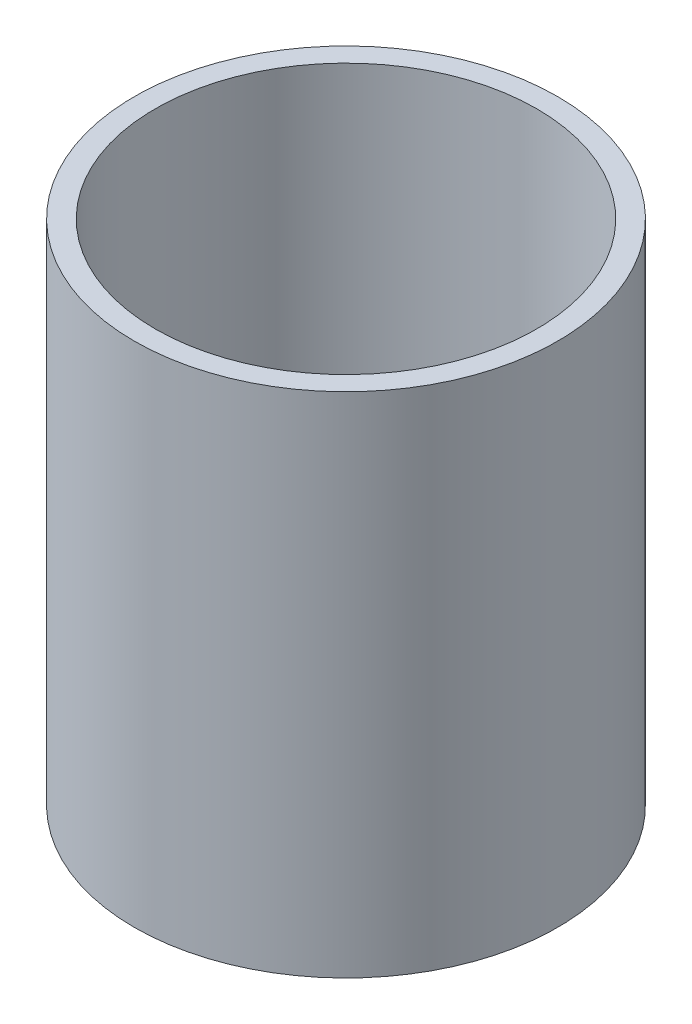
ISO-10303-21;
HEADER;
FILE_DESCRIPTION(('STEP AP214'),'2;1');
FILE_NAME('part.step','',(''),(''),'','','');
FILE_SCHEMA(('AUTOMOTIVE_DESIGN { 1 0 10303 214 1 1 1 1 }'));
ENDSEC;
DATA;
#1=APPLICATION_CONTEXT('core data for automotive mechanical design processes');
#2=APPLICATION_PROTOCOL_DEFINITION('international standard','automotive_design',2000,#1);
#3=PRODUCT_CONTEXT('',#1,'mechanical');
#4=PRODUCT('Part','Part','',(#3));
#5=PRODUCT_RELATED_PRODUCT_CATEGORY('part','',(#4));
#6=PRODUCT_DEFINITION_FORMATION('','',#4);
#7=PRODUCT_DEFINITION_CONTEXT('part definition',#1,'design');
#8=PRODUCT_DEFINITION('design','',#6,#7);
#9=PRODUCT_DEFINITION_SHAPE('','',#8);
#10=(LENGTH_UNIT() NAMED_UNIT(*) SI_UNIT(.MILLI.,.METRE.));
#11=(NAMED_UNIT(*) PLANE_ANGLE_UNIT() SI_UNIT($,.RADIAN.));
#12=(NAMED_UNIT(*) SI_UNIT($,.STERADIAN.) SOLID_ANGLE_UNIT());
#13=UNCERTAINTY_MEASURE_WITH_UNIT(LENGTH_MEASURE(1.E-05),#10,'distance_accuracy_value','');
#14=(GEOMETRIC_REPRESENTATION_CONTEXT(3) GLOBAL_UNCERTAINTY_ASSIGNED_CONTEXT((#13)) GLOBAL_UNIT_ASSIGNED_CONTEXT((#10,
#11,#12)) REPRESENTATION_CONTEXT('',''));
#15=CARTESIAN_POINT('',(0.,0.,0.));
#16=DIRECTION('',(0.,0.,1.));
#17=DIRECTION('',(1.,0.,0.));
#18=AXIS2_PLACEMENT_3D('',#15,#16,#17);
#19=CARTESIAN_POINT('',(0.,152.4,0.));
#20=DIRECTION('',(0.,-1.,0.));
#21=DIRECTION('',(0.,0.,-1.));
#22=AXIS2_PLACEMENT_3D('',#19,#20,#21);
#23=CYLINDRICAL_SURFACE('',#22,63.5573488145465);
#24=CARTESIAN_POINT('',(0.,152.4,0.));
#25=DIRECTION('',(0.,1.,0.));
#26=DIRECTION('',(0.,0.,1.));
#27=AXIS2_PLACEMENT_3D('',#24,#25,#26);
#28=CIRCLE('',#27,63.5573488145465);
#29=CARTESIAN_POINT('',(0.,152.4,-63.5573488145465));
#30=VERTEX_POINT('',#29);
#31=EDGE_CURVE('E10',#30,#30,#28,.T.);
#32=CARTESIAN_POINT('',(0.,0.,0.));
#33=DIRECTION('',(0.,1.,0.));
#34=DIRECTION('',(0.,0.,1.));
#35=AXIS2_PLACEMENT_3D('',#32,#33,#34);
#36=CIRCLE('',#35,63.5573488145465);
#37=CARTESIAN_POINT('',(0.,0.,-63.5573488145465));
#38=VERTEX_POINT('',#37);
#39=EDGE_CURVE('E40',#38,#38,#36,.T.);
#40=CARTESIAN_POINT('',(0.,152.4,-63.5573488145465));
#41=CARTESIAN_POINT('',(0.,150.8125,-63.5573488145465));
#42=CARTESIAN_POINT('',(0.,149.225,-63.5573488145465));
#43=CARTESIAN_POINT('',(0.,146.05,-63.5573488145465));
#44=CARTESIAN_POINT('',(0.,144.4625,-63.5573488145465));
#45=CARTESIAN_POINT('',(0.,141.2875,-63.5573488145465));
#46=CARTESIAN_POINT('',(0.,139.7,-63.5573488145465));
#47=CARTESIAN_POINT('',(0.,136.525,-63.5573488145465));
#48=CARTESIAN_POINT('',(0.,134.9375,-63.5573488145465));
#49=CARTESIAN_POINT('',(0.,131.7625,-63.5573488145465));
#50=CARTESIAN_POINT('',(0.,130.175,-63.5573488145465));
#51=CARTESIAN_POINT('',(0.,127.,-63.5573488145465));
#52=CARTESIAN_POINT('',(0.,125.4125,-63.5573488145465));
#53=CARTESIAN_POINT('',(0.,122.2375,-63.5573488145465));
#54=CARTESIAN_POINT('',(0.,120.65,-63.5573488145465));
#55=CARTESIAN_POINT('',(0.,117.475,-63.5573488145465));
#56=CARTESIAN_POINT('',(0.,115.8875,-63.5573488145465));
#57=CARTESIAN_POINT('',(0.,112.7125,-63.5573488145465));
#58=CARTESIAN_POINT('',(0.,111.125,-63.5573488145465));
#59=CARTESIAN_POINT('',(0.,107.95,-63.5573488145465));
#60=CARTESIAN_POINT('',(0.,106.3625,-63.5573488145465));
#61=CARTESIAN_POINT('',(0.,103.1875,-63.5573488145465));
#62=CARTESIAN_POINT('',(0.,101.6,-63.5573488145465));
#63=CARTESIAN_POINT('',(0.,98.425,-63.5573488145465));
#64=CARTESIAN_POINT('',(0.,96.8375,-63.5573488145465));
#65=CARTESIAN_POINT('',(0.,93.6625,-63.5573488145465));
#66=CARTESIAN_POINT('',(0.,92.075,-63.5573488145465));
#67=CARTESIAN_POINT('',(0.,88.9,-63.5573488145465));
#68=CARTESIAN_POINT('',(0.,87.3125,-63.5573488145465));
#69=CARTESIAN_POINT('',(0.,84.1375,-63.5573488145465));
#70=CARTESIAN_POINT('',(0.,82.55,-63.5573488145465));
#71=CARTESIAN_POINT('',(0.,79.375,-63.5573488145465));
#72=CARTESIAN_POINT('',(0.,77.7875,-63.5573488145465));
#73=CARTESIAN_POINT('',(0.,74.6125,-63.5573488145465));
#74=CARTESIAN_POINT('',(0.,73.025,-63.5573488145465));
#75=CARTESIAN_POINT('',(0.,69.85,-63.5573488145465));
#76=CARTESIAN_POINT('',(0.,68.2625,-63.5573488145465));
#77=CARTESIAN_POINT('',(0.,65.0875,-63.5573488145465));
#78=CARTESIAN_POINT('',(0.,63.5,-63.5573488145465));
#79=CARTESIAN_POINT('',(0.,60.325,-63.5573488145465));
#80=CARTESIAN_POINT('',(0.,58.7375,-63.5573488145465));
#81=CARTESIAN_POINT('',(0.,55.5625,-63.5573488145465));
#82=CARTESIAN_POINT('',(0.,53.975,-63.5573488145465));
#83=CARTESIAN_POINT('',(0.,50.8,-63.5573488145465));
#84=CARTESIAN_POINT('',(0.,49.2125,-63.5573488145465));
#85=CARTESIAN_POINT('',(0.,46.0375,-63.5573488145465));
#86=CARTESIAN_POINT('',(0.,44.45,-63.5573488145465));
#87=CARTESIAN_POINT('',(0.,41.275,-63.5573488145465));
#88=CARTESIAN_POINT('',(0.,39.6875,-63.5573488145465));
#89=CARTESIAN_POINT('',(0.,36.5125,-63.5573488145465));
#90=CARTESIAN_POINT('',(0.,34.925,-63.5573488145465));
#91=CARTESIAN_POINT('',(0.,31.75,-63.5573488145465));
#92=CARTESIAN_POINT('',(0.,30.1625,-63.5573488145465));
#93=CARTESIAN_POINT('',(0.,26.9875,-63.5573488145465));
#94=CARTESIAN_POINT('',(0.,25.4,-63.5573488145465));
#95=CARTESIAN_POINT('',(0.,22.225,-63.5573488145465));
#96=CARTESIAN_POINT('',(0.,20.6375,-63.5573488145465));
#97=CARTESIAN_POINT('',(0.,17.4625,-63.5573488145465));
#98=CARTESIAN_POINT('',(0.,15.875,-63.5573488145465));
#99=CARTESIAN_POINT('',(0.,12.7,-63.5573488145465));
#100=CARTESIAN_POINT('',(0.,11.1125,-63.5573488145465));
#101=CARTESIAN_POINT('',(0.,7.93750000000001,-63.5573488145465));
#102=CARTESIAN_POINT('',(0.,6.35,-63.5573488145465));
#103=CARTESIAN_POINT('',(0.,3.175,-63.5573488145465));
#104=CARTESIAN_POINT('',(0.,1.5875,-63.5573488145465));
#105=CARTESIAN_POINT('',(0.,0.,-63.5573488145465));
#106=B_SPLINE_CURVE_WITH_KNOTS('',3,(#40,#41,#42,#43,#44,#45,#46,#47,#48,#49,#50,#51,#52,#53,
#54,#55,#56,#57,#58,#59,#60,#61,#62,#63,#64,#65,#66,#67,#68,#69,#70,#71,#72,#73,#74,#75,#76,#77,
#78,#79,#80,#81,#82,#83,#84,#85,#86,#87,#88,#89,#90,#91,#92,#93,#94,#95,#96,#97,#98,#99,#100,
#101,#102,#103,#104,#105),.UNSPECIFIED.,.F.,.F.,(4,2,2,2,2,2,2,2,2,2,2,2,2,2,2,2,2,2,2,2,2,2,2,
2,2,2,2,2,2,2,2,2,4),(0.,4.76249999999998,9.52499999999998,14.2875,19.05,23.8125,28.575,33.3375,
38.1,42.8625,47.625,52.3875,57.15,61.9125,66.675,71.4375,76.2,80.9625,85.725,90.4875,95.25,
100.0125,104.775,109.5375,114.3,119.0625,123.825,128.5875,133.35,138.1125,142.875,147.6375,
152.4),.UNSPECIFIED.);
#107=EDGE_CURVE('BSEAM37',#30,#38,#106,.T.);
#108=ORIENTED_EDGE('',*,*,#31,.F.);
#109=ORIENTED_EDGE('',*,*,#39,.T.);
#110=ORIENTED_EDGE('',*,*,#107,.T.);
#111=ORIENTED_EDGE('',*,*,#107,.F.);
#112=EDGE_LOOP('',(#108,#110,#109,#111));
#113=FACE_BOUND('',#112,.T.);
#114=ADVANCED_FACE('F37',(#113),#23,.T.);
#115=CARTESIAN_POINT('',(0.,152.4,0.));
#116=DIRECTION('',(0.,1.,0.));
#117=DIRECTION('',(0.,0.,1.));
#118=AXIS2_PLACEMENT_3D('',#115,#116,#117);
#119=PLANE('',#118);
#120=CARTESIAN_POINT('',(0.,152.4,0.));
#121=DIRECTION('',(0.,-1.,0.));
#122=DIRECTION('',(0.,0.,-1.));
#123=AXIS2_PLACEMENT_3D('',#120,#121,#122);
#124=CIRCLE('',#123,57.2544837515335);
#125=CARTESIAN_POINT('',(0.,152.4,-57.2544837515335));
#126=VERTEX_POINT('',#125);
#127=EDGE_CURVE('E49',#126,#126,#124,.T.);
#128=ORIENTED_EDGE('',*,*,#127,.T.);
#129=EDGE_LOOP('',(#128));
#130=FACE_BOUND('',#129,.T.);
#131=ORIENTED_EDGE('',*,*,#31,.T.);
#132=EDGE_LOOP('',(#131));
#133=FACE_BOUND('',#132,.T.);
#134=ADVANCED_FACE('F59',(#130,#133),#119,.T.);
#135=CARTESIAN_POINT('',(0.,0.,0.));
#136=DIRECTION('',(0.,1.,0.));
#137=DIRECTION('',(0.,0.,1.));
#138=AXIS2_PLACEMENT_3D('',#135,#136,#137);
#139=PLANE('',#138);
#140=CARTESIAN_POINT('',(0.,0.,0.));
#141=DIRECTION('',(0.,-1.,0.));
#142=DIRECTION('',(0.,0.,-1.));
#143=AXIS2_PLACEMENT_3D('',#140,#141,#142);
#144=CIRCLE('',#143,57.2544837515335);
#145=CARTESIAN_POINT('',(0.,0.,-57.2544837515335));
#146=VERTEX_POINT('',#145);
#147=EDGE_CURVE('E51',#146,#146,#144,.T.);
#148=ORIENTED_EDGE('',*,*,#147,.F.);
#149=EDGE_LOOP('',(#148));
#150=FACE_BOUND('',#149,.T.);
#151=ORIENTED_EDGE('',*,*,#39,.F.);
#152=EDGE_LOOP('',(#151));
#153=FACE_BOUND('',#152,.T.);
#154=ADVANCED_FACE('F64',(#150,#153),#139,.F.);
#155=CARTESIAN_POINT('',(0.,152.4,0.));
#156=DIRECTION('',(0.,-1.,0.));
#157=DIRECTION('',(0.,0.,-1.));
#158=AXIS2_PLACEMENT_3D('',#155,#156,#157);
#159=CYLINDRICAL_SURFACE('',#158,57.2544837515335);
#160=CARTESIAN_POINT('',(0.,152.4,-57.2544837515335));
#161=CARTESIAN_POINT('',(0.,150.8125,-57.2544837515335));
#162=CARTESIAN_POINT('',(0.,149.225,-57.2544837515335));
#163=CARTESIAN_POINT('',(0.,146.05,-57.2544837515335));
#164=CARTESIAN_POINT('',(0.,144.4625,-57.2544837515335));
#165=CARTESIAN_POINT('',(0.,141.2875,-57.2544837515335));
#166=CARTESIAN_POINT('',(0.,139.7,-57.2544837515335));
#167=CARTESIAN_POINT('',(0.,136.525,-57.2544837515335));
#168=CARTESIAN_POINT('',(0.,134.9375,-57.2544837515335));
#169=CARTESIAN_POINT('',(0.,131.7625,-57.2544837515335));
#170=CARTESIAN_POINT('',(0.,130.175,-57.2544837515335));
#171=CARTESIAN_POINT('',(0.,127.,-57.2544837515335));
#172=CARTESIAN_POINT('',(0.,125.4125,-57.2544837515335));
#173=CARTESIAN_POINT('',(0.,122.2375,-57.2544837515335));
#174=CARTESIAN_POINT('',(0.,120.65,-57.2544837515335));
#175=CARTESIAN_POINT('',(0.,117.475,-57.2544837515335));
#176=CARTESIAN_POINT('',(0.,115.8875,-57.2544837515335));
#177=CARTESIAN_POINT('',(0.,112.7125,-57.2544837515335));
#178=CARTESIAN_POINT('',(0.,111.125,-57.2544837515335));
#179=CARTESIAN_POINT('',(0.,107.95,-57.2544837515335));
#180=CARTESIAN_POINT('',(0.,106.3625,-57.2544837515335));
#181=CARTESIAN_POINT('',(0.,103.1875,-57.2544837515335));
#182=CARTESIAN_POINT('',(0.,101.6,-57.2544837515335));
#183=CARTESIAN_POINT('',(0.,98.425,-57.2544837515335));
#184=CARTESIAN_POINT('',(0.,96.8375,-57.2544837515335));
#185=CARTESIAN_POINT('',(0.,93.6625,-57.2544837515335));
#186=CARTESIAN_POINT('',(0.,92.075,-57.2544837515335));
#187=CARTESIAN_POINT('',(0.,88.9,-57.2544837515335));
#188=CARTESIAN_POINT('',(0.,87.3125,-57.2544837515335));
#189=CARTESIAN_POINT('',(0.,84.1375,-57.2544837515335));
#190=CARTESIAN_POINT('',(0.,82.55,-57.2544837515335));
#191=CARTESIAN_POINT('',(0.,79.375,-57.2544837515335));
#192=CARTESIAN_POINT('',(0.,77.7875,-57.2544837515335));
#193=CARTESIAN_POINT('',(0.,74.6125,-57.2544837515335));
#194=CARTESIAN_POINT('',(0.,73.025,-57.2544837515335));
#195=CARTESIAN_POINT('',(0.,69.85,-57.2544837515335));
#196=CARTESIAN_POINT('',(0.,68.2625,-57.2544837515335));
#197=CARTESIAN_POINT('',(0.,65.0875,-57.2544837515335));
#198=CARTESIAN_POINT('',(0.,63.5,-57.2544837515335));
#199=CARTESIAN_POINT('',(0.,60.325,-57.2544837515335));
#200=CARTESIAN_POINT('',(0.,58.7375,-57.2544837515335));
#201=CARTESIAN_POINT('',(0.,55.5625,-57.2544837515335));
#202=CARTESIAN_POINT('',(0.,53.975,-57.2544837515335));
#203=CARTESIAN_POINT('',(0.,50.8,-57.2544837515335));
#204=CARTESIAN_POINT('',(0.,49.2125,-57.2544837515335));
#205=CARTESIAN_POINT('',(0.,46.0375,-57.2544837515335));
#206=CARTESIAN_POINT('',(0.,44.45,-57.2544837515335));
#207=CARTESIAN_POINT('',(0.,41.275,-57.2544837515335));
#208=CARTESIAN_POINT('',(0.,39.6875,-57.2544837515335));
#209=CARTESIAN_POINT('',(0.,36.5125,-57.2544837515335));
#210=CARTESIAN_POINT('',(0.,34.925,-57.2544837515335));
#211=CARTESIAN_POINT('',(0.,31.75,-57.2544837515335));
#212=CARTESIAN_POINT('',(0.,30.1625,-57.2544837515335));
#213=CARTESIAN_POINT('',(0.,26.9875,-57.2544837515335));
#214=CARTESIAN_POINT('',(0.,25.4,-57.2544837515335));
#215=CARTESIAN_POINT('',(0.,22.225,-57.2544837515335));
#216=CARTESIAN_POINT('',(0.,20.6375,-57.2544837515335));
#217=CARTESIAN_POINT('',(0.,17.4625,-57.2544837515335));
#218=CARTESIAN_POINT('',(0.,15.875,-57.2544837515335));
#219=CARTESIAN_POINT('',(0.,12.7,-57.2544837515335));
#220=CARTESIAN_POINT('',(0.,11.1125,-57.2544837515335));
#221=CARTESIAN_POINT('',(0.,7.93750000000001,-57.2544837515335));
#222=CARTESIAN_POINT('',(0.,6.35,-57.2544837515335));
#223=CARTESIAN_POINT('',(0.,3.175,-57.2544837515335));
#224=CARTESIAN_POINT('',(0.,1.5875,-57.2544837515335));
#225=CARTESIAN_POINT('',(0.,0.,-57.2544837515335));
#226=B_SPLINE_CURVE_WITH_KNOTS('',3,(#160,#161,#162,#163,#164,#165,#166,#167,#168,#169,#170,
#171,#172,#173,#174,#175,#176,#177,#178,#179,#180,#181,#182,#183,#184,#185,#186,#187,#188,#189,
#190,#191,#192,#193,#194,#195,#196,#197,#198,#199,#200,#201,#202,#203,#204,#205,#206,#207,#208,
#209,#210,#211,#212,#213,#214,#215,#216,#217,#218,#219,#220,#221,#222,#223,#224,#225),
.UNSPECIFIED.,.F.,.F.,(4,2,2,2,2,2,2,2,2,2,2,2,2,2,2,2,2,2,2,2,2,2,2,2,2,2,2,2,2,2,2,2,4),(0.,
4.7625,9.52500000000001,14.2875,19.05,23.8125,28.575,33.3375,38.1,42.8625,47.625,52.3875,57.15,
61.9125,66.675,71.4375,76.2,80.9625,85.725,90.4875,95.25,100.0125,104.775,109.5375,114.3,
119.0625,123.825,128.5875,133.35,138.1125,142.875,147.6375,152.4),.UNSPECIFIED.);
#227=EDGE_CURVE('BSEAM61',#126,#146,#226,.T.);
#228=ORIENTED_EDGE('',*,*,#127,.F.);
#229=ORIENTED_EDGE('',*,*,#147,.T.);
#230=ORIENTED_EDGE('',*,*,#227,.T.);
#231=ORIENTED_EDGE('',*,*,#227,.F.);
#232=EDGE_LOOP('',(#228,#230,#229,#231));
#233=FACE_BOUND('',#232,.T.);
#234=ADVANCED_FACE('F61',(#233),#159,.F.);
#235=CLOSED_SHELL('',(#114,#134,#154,#234));
#236=MANIFOLD_SOLID_BREP('B2',#235);
#237=ADVANCED_BREP_SHAPE_REPRESENTATION('',(#18,#236),#14);
#238=SHAPE_DEFINITION_REPRESENTATION(#9,#237);
ENDSEC;
END-ISO-10303-21;
